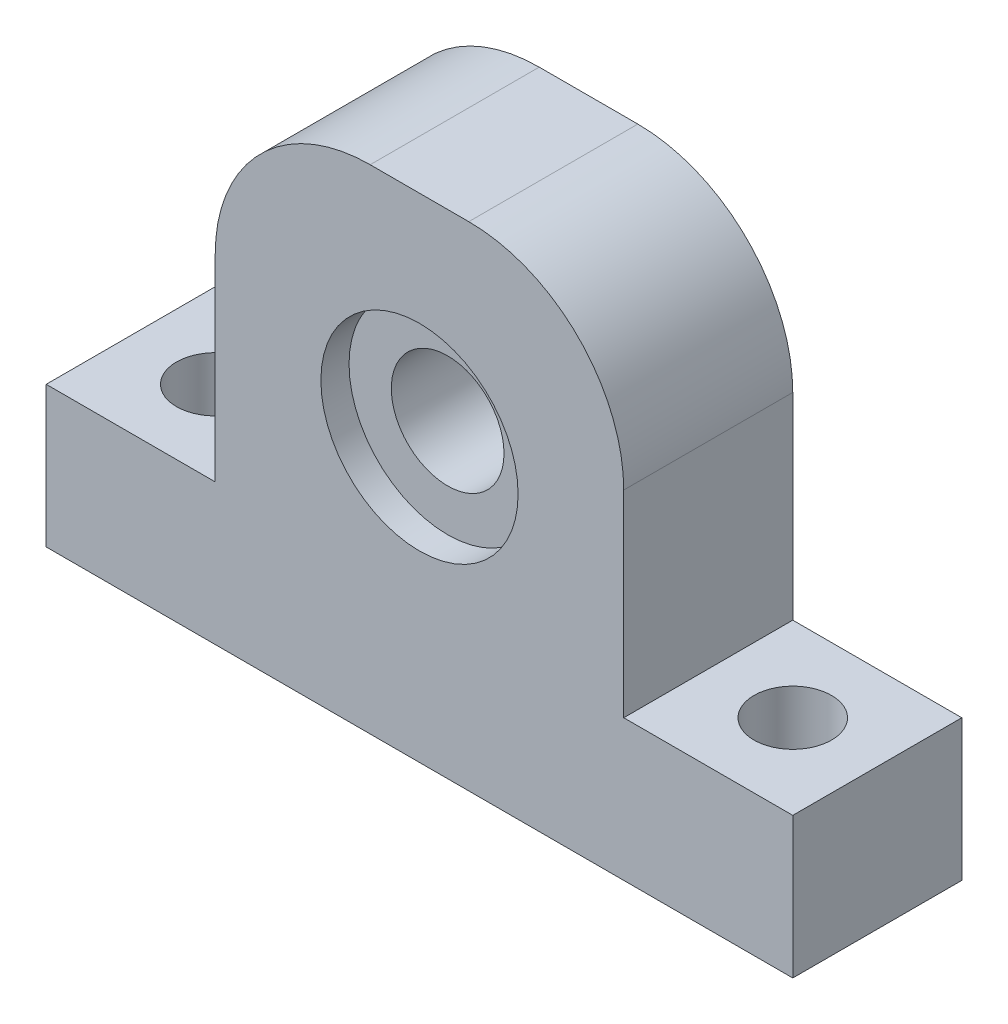
ISO-10303-21;
HEADER;
FILE_DESCRIPTION(('STEP AP214'),'2;1');
FILE_NAME('part.step','',(''),(''),'','','');
FILE_SCHEMA(('AUTOMOTIVE_DESIGN { 1 0 10303 214 1 1 1 1 }'));
ENDSEC;
DATA;
#1=APPLICATION_CONTEXT('core data for automotive mechanical design processes');
#2=APPLICATION_PROTOCOL_DEFINITION('international standard','automotive_design',2000,#1);
#3=PRODUCT_CONTEXT('',#1,'mechanical');
#4=PRODUCT('Part','Part','',(#3));
#5=PRODUCT_RELATED_PRODUCT_CATEGORY('part','',(#4));
#6=PRODUCT_DEFINITION_FORMATION('','',#4);
#7=PRODUCT_DEFINITION_CONTEXT('part definition',#1,'design');
#8=PRODUCT_DEFINITION('design','',#6,#7);
#9=PRODUCT_DEFINITION_SHAPE('','',#8);
#10=(LENGTH_UNIT() NAMED_UNIT(*) SI_UNIT(.MILLI.,.METRE.));
#11=(NAMED_UNIT(*) PLANE_ANGLE_UNIT() SI_UNIT($,.RADIAN.));
#12=(NAMED_UNIT(*) SI_UNIT($,.STERADIAN.) SOLID_ANGLE_UNIT());
#13=UNCERTAINTY_MEASURE_WITH_UNIT(LENGTH_MEASURE(1.E-05),#10,'distance_accuracy_value','');
#14=(GEOMETRIC_REPRESENTATION_CONTEXT(3) GLOBAL_UNCERTAINTY_ASSIGNED_CONTEXT((#13)) GLOBAL_UNIT_ASSIGNED_CONTEXT((#10,
#11,#12)) REPRESENTATION_CONTEXT('',''));
#15=CARTESIAN_POINT('',(0.,0.,0.));
#16=DIRECTION('',(0.,0.,1.));
#17=DIRECTION('',(1.,0.,0.));
#18=AXIS2_PLACEMENT_3D('',#15,#16,#17);
#19=CARTESIAN_POINT('',(0.,0.,-6.));
#20=DIRECTION('',(0.,0.,1.));
#21=DIRECTION('',(1.,0.,0.));
#22=AXIS2_PLACEMENT_3D('',#19,#20,#21);
#23=CYLINDRICAL_SURFACE('',#22,4.);
#24=CARTESIAN_POINT('',(0.,0.,4.));
#25=DIRECTION('',(0.,0.,1.));
#26=DIRECTION('',(1.,0.,0.));
#27=AXIS2_PLACEMENT_3D('',#24,#25,#26);
#28=CIRCLE('',#27,4.);
#29=CARTESIAN_POINT('',(4.,0.,4.));
#30=VERTEX_POINT('',#29);
#31=EDGE_CURVE('E130',#30,#30,#28,.F.);
#32=ORIENTED_EDGE('',*,*,#31,.F.);
#33=EDGE_LOOP('',(#32));
#34=FACE_BOUND('',#33,.T.);
#35=CARTESIAN_POINT('',(0.,0.,-4.));
#36=DIRECTION('',(0.,0.,-1.));
#37=DIRECTION('',(-1.,0.,0.));
#38=AXIS2_PLACEMENT_3D('',#35,#36,#37);
#39=CIRCLE('',#38,4.);
#40=CARTESIAN_POINT('',(-4.,0.,-4.));
#41=VERTEX_POINT('',#40);
#42=EDGE_CURVE('E195',#41,#41,#39,.F.);
#43=ORIENTED_EDGE('',*,*,#42,.F.);
#44=EDGE_LOOP('',(#43));
#45=FACE_BOUND('',#44,.T.);
#46=ADVANCED_FACE('F32',(#34,#45),#23,.F.);
#47=CARTESIAN_POINT('',(-3.5,4.,-6.));
#48=DIRECTION('',(0.,0.,1.));
#49=DIRECTION('',(1.,0.,0.));
#50=AXIS2_PLACEMENT_3D('',#47,#48,#49);
#51=CYLINDRICAL_SURFACE('',#50,11.);
#52=DIRECTION('',(0.,0.,1.));
#53=VECTOR('',#52,1.);
#54=CARTESIAN_POINT('',(-14.5,4.,-6.));
#55=LINE('',#54,#53);
#56=CARTESIAN_POINT('',(-14.5,4.,-6.));
#57=VERTEX_POINT('',#56);
#58=CARTESIAN_POINT('',(-14.5,4.,6.));
#59=VERTEX_POINT('',#58);
#60=EDGE_CURVE('E107',#57,#59,#55,.T.);
#61=ORIENTED_EDGE('',*,*,#60,.T.);
#62=CARTESIAN_POINT('',(-3.5,4.,6.));
#63=DIRECTION('',(0.,0.,1.));
#64=DIRECTION('',(1.,0.,0.));
#65=AXIS2_PLACEMENT_3D('',#62,#63,#64);
#66=CIRCLE('',#65,11.);
#67=CARTESIAN_POINT('',(-3.5,15.,6.));
#68=VERTEX_POINT('',#67);
#69=EDGE_CURVE('E110',#68,#59,#66,.T.);
#70=ORIENTED_EDGE('',*,*,#69,.F.);
#71=DIRECTION('',(0.,0.,1.));
#72=VECTOR('',#71,1.);
#73=CARTESIAN_POINT('',(-3.5,15.,-6.));
#74=LINE('',#73,#72);
#75=CARTESIAN_POINT('',(-3.5,15.,-6.));
#76=VERTEX_POINT('',#75);
#77=EDGE_CURVE('E11',#76,#68,#74,.T.);
#78=ORIENTED_EDGE('',*,*,#77,.F.);
#79=CARTESIAN_POINT('',(-3.5,4.,-6.));
#80=DIRECTION('',(0.,0.,1.));
#81=DIRECTION('',(1.,0.,0.));
#82=AXIS2_PLACEMENT_3D('',#79,#80,#81);
#83=CIRCLE('',#82,11.);
#84=EDGE_CURVE('E111',#76,#57,#83,.T.);
#85=ORIENTED_EDGE('',*,*,#84,.T.);
#86=EDGE_LOOP('',(#61,#70,#78,#85));
#87=FACE_BOUND('',#86,.T.);
#88=ADVANCED_FACE('F34',(#87),#51,.T.);
#89=CARTESIAN_POINT('',(3.5,15.,-6.));
#90=DIRECTION('',(0.,1.,0.));
#91=DIRECTION('',(0.,0.,1.));
#92=AXIS2_PLACEMENT_3D('',#89,#90,#91);
#93=PLANE('',#92);
#94=ORIENTED_EDGE('',*,*,#77,.T.);
#95=DIRECTION('',(-1.,0.,0.));
#96=VECTOR('',#95,1.);
#97=CARTESIAN_POINT('',(3.5,15.,6.));
#98=LINE('',#97,#96);
#99=CARTESIAN_POINT('',(3.5,15.,6.));
#100=VERTEX_POINT('',#99);
#101=EDGE_CURVE('E129',#100,#68,#98,.T.);
#102=ORIENTED_EDGE('',*,*,#101,.F.);
#103=DIRECTION('',(0.,0.,1.));
#104=VECTOR('',#103,1.);
#105=CARTESIAN_POINT('',(3.5,15.,-6.));
#106=LINE('',#105,#104);
#107=CARTESIAN_POINT('',(3.5,15.,-6.));
#108=VERTEX_POINT('',#107);
#109=EDGE_CURVE('E41',#108,#100,#106,.T.);
#110=ORIENTED_EDGE('',*,*,#109,.F.);
#111=DIRECTION('',(-1.,0.,0.));
#112=VECTOR('',#111,1.);
#113=CARTESIAN_POINT('',(3.5,15.,-6.));
#114=LINE('',#113,#112);
#115=EDGE_CURVE('E116',#108,#76,#114,.T.);
#116=ORIENTED_EDGE('',*,*,#115,.T.);
#117=EDGE_LOOP('',(#94,#102,#110,#116));
#118=FACE_BOUND('',#117,.T.);
#119=ADVANCED_FACE('F240',(#118),#93,.T.);
#120=CARTESIAN_POINT('',(3.5,4.,-6.));
#121=DIRECTION('',(0.,0.,1.));
#122=DIRECTION('',(1.,0.,0.));
#123=AXIS2_PLACEMENT_3D('',#120,#121,#122);
#124=CYLINDRICAL_SURFACE('',#123,11.);
#125=ORIENTED_EDGE('',*,*,#109,.T.);
#126=CARTESIAN_POINT('',(3.5,4.,6.));
#127=DIRECTION('',(0.,0.,1.));
#128=DIRECTION('',(-1.,0.,0.));
#129=AXIS2_PLACEMENT_3D('',#126,#127,#128);
#130=CIRCLE('',#129,11.);
#131=CARTESIAN_POINT('',(14.5,4.00000000000001,6.));
#132=VERTEX_POINT('',#131);
#133=EDGE_CURVE('E155',#132,#100,#130,.T.);
#134=ORIENTED_EDGE('',*,*,#133,.F.);
#135=DIRECTION('',(0.,0.,1.));
#136=VECTOR('',#135,1.);
#137=CARTESIAN_POINT('',(14.5,4.00000000000001,-6.));
#138=LINE('',#137,#136);
#139=CARTESIAN_POINT('',(14.5,4.00000000000001,-6.));
#140=VERTEX_POINT('',#139);
#141=EDGE_CURVE('E183',#140,#132,#138,.T.);
#142=ORIENTED_EDGE('',*,*,#141,.F.);
#143=CARTESIAN_POINT('',(3.5,4.,-6.));
#144=DIRECTION('',(0.,0.,1.));
#145=DIRECTION('',(-1.,0.,0.));
#146=AXIS2_PLACEMENT_3D('',#143,#144,#145);
#147=CIRCLE('',#146,11.);
#148=EDGE_CURVE('E179',#140,#108,#147,.T.);
#149=ORIENTED_EDGE('',*,*,#148,.T.);
#150=EDGE_LOOP('',(#125,#134,#142,#149));
#151=FACE_BOUND('',#150,.T.);
#152=ADVANCED_FACE('F246',(#151),#124,.T.);
#153=CARTESIAN_POINT('',(14.5,4.00000000000001,-6.));
#154=DIRECTION('',(1.,0.,0.));
#155=DIRECTION('',(0.,0.,-1.));
#156=AXIS2_PLACEMENT_3D('',#153,#154,#155);
#157=PLANE('',#156);
#158=ORIENTED_EDGE('',*,*,#141,.T.);
#159=DIRECTION('',(0.,1.,0.));
#160=VECTOR('',#159,1.);
#161=CARTESIAN_POINT('',(14.5,4.00000000000001,6.));
#162=LINE('',#161,#160);
#163=CARTESIAN_POINT('',(14.5,-10.,6.));
#164=VERTEX_POINT('',#163);
#165=EDGE_CURVE('E152',#164,#132,#162,.T.);
#166=ORIENTED_EDGE('',*,*,#165,.F.);
#167=DIRECTION('',(0.,0.,1.));
#168=VECTOR('',#167,1.);
#169=CARTESIAN_POINT('',(14.5,-10.,-6.));
#170=LINE('',#169,#168);
#171=CARTESIAN_POINT('',(14.5,-10.,-6.));
#172=VERTEX_POINT('',#171);
#173=EDGE_CURVE('E185',#172,#164,#170,.T.);
#174=ORIENTED_EDGE('',*,*,#173,.F.);
#175=DIRECTION('',(0.,1.,0.));
#176=VECTOR('',#175,1.);
#177=CARTESIAN_POINT('',(14.5,4.00000000000001,-6.));
#178=LINE('',#177,#176);
#179=EDGE_CURVE('E176',#172,#140,#178,.T.);
#180=ORIENTED_EDGE('',*,*,#179,.T.);
#181=EDGE_LOOP('',(#158,#166,#174,#180));
#182=FACE_BOUND('',#181,.T.);
#183=ADVANCED_FACE('F249',(#182),#157,.T.);
#184=CARTESIAN_POINT('',(14.5,-10.,-6.));
#185=DIRECTION('',(0.,1.,0.));
#186=DIRECTION('',(-1.,0.,0.));
#187=AXIS2_PLACEMENT_3D('',#184,#185,#186);
#188=PLANE('',#187);
#189=CARTESIAN_POINT('',(20.5,-9.99999999999999,0.));
#190=DIRECTION('',(0.,1.,0.));
#191=DIRECTION('',(-1.,0.,0.));
#192=AXIS2_PLACEMENT_3D('',#189,#190,#191);
#193=CIRCLE('',#192,2.75);
#194=CARTESIAN_POINT('',(17.75,-9.99999999999999,0.));
#195=VERTEX_POINT('',#194);
#196=EDGE_CURVE('E351',#195,#195,#193,.T.);
#197=ORIENTED_EDGE('',*,*,#196,.F.);
#198=EDGE_LOOP('',(#197));
#199=FACE_BOUND('',#198,.T.);
#200=ORIENTED_EDGE('',*,*,#173,.T.);
#201=DIRECTION('',(-1.,0.,0.));
#202=VECTOR('',#201,1.);
#203=CARTESIAN_POINT('',(14.5,-10.,6.));
#204=LINE('',#203,#202);
#205=CARTESIAN_POINT('',(26.5,-9.99999999999999,6.));
#206=VERTEX_POINT('',#205);
#207=EDGE_CURVE('E149',#206,#164,#204,.T.);
#208=ORIENTED_EDGE('',*,*,#207,.F.);
#209=DIRECTION('',(0.,0.,1.));
#210=VECTOR('',#209,1.);
#211=CARTESIAN_POINT('',(26.5,-9.99999999999999,-6.));
#212=LINE('',#211,#210);
#213=CARTESIAN_POINT('',(26.5,-9.99999999999999,-6.));
#214=VERTEX_POINT('',#213);
#215=EDGE_CURVE('E187',#214,#206,#212,.T.);
#216=ORIENTED_EDGE('',*,*,#215,.F.);
#217=DIRECTION('',(-1.,0.,0.));
#218=VECTOR('',#217,1.);
#219=CARTESIAN_POINT('',(14.5,-10.,-6.));
#220=LINE('',#219,#218);
#221=EDGE_CURVE('E173',#214,#172,#220,.T.);
#222=ORIENTED_EDGE('',*,*,#221,.T.);
#223=EDGE_LOOP('',(#200,#208,#216,#222));
#224=FACE_BOUND('',#223,.T.);
#225=ADVANCED_FACE('F253',(#199,#224),#188,.T.);
#226=CARTESIAN_POINT('',(26.5,-9.99999999999999,-6.));
#227=DIRECTION('',(1.,0.,0.));
#228=DIRECTION('',(0.,0.,-1.));
#229=AXIS2_PLACEMENT_3D('',#226,#227,#228);
#230=PLANE('',#229);
#231=ORIENTED_EDGE('',*,*,#215,.T.);
#232=DIRECTION('',(0.,1.,0.));
#233=VECTOR('',#232,1.);
#234=CARTESIAN_POINT('',(26.5,-9.99999999999999,6.));
#235=LINE('',#234,#233);
#236=CARTESIAN_POINT('',(26.5,-20.,6.));
#237=VERTEX_POINT('',#236);
#238=EDGE_CURVE('E146',#237,#206,#235,.T.);
#239=ORIENTED_EDGE('',*,*,#238,.F.);
#240=DIRECTION('',(0.,0.,1.));
#241=VECTOR('',#240,1.);
#242=CARTESIAN_POINT('',(26.5,-20.,-6.));
#243=LINE('',#242,#241);
#244=CARTESIAN_POINT('',(26.5,-20.,-6.));
#245=VERTEX_POINT('',#244);
#246=EDGE_CURVE('E189',#245,#237,#243,.T.);
#247=ORIENTED_EDGE('',*,*,#246,.F.);
#248=DIRECTION('',(0.,1.,0.));
#249=VECTOR('',#248,1.);
#250=CARTESIAN_POINT('',(26.5,-9.99999999999999,-6.));
#251=LINE('',#250,#249);
#252=EDGE_CURVE('E170',#245,#214,#251,.T.);
#253=ORIENTED_EDGE('',*,*,#252,.T.);
#254=EDGE_LOOP('',(#231,#239,#247,#253));
#255=FACE_BOUND('',#254,.T.);
#256=ADVANCED_FACE('F257',(#255),#230,.T.);
#257=CARTESIAN_POINT('',(-26.5,-20.,-6.));
#258=DIRECTION('',(0.,-1.,0.));
#259=DIRECTION('',(1.,0.,0.));
#260=AXIS2_PLACEMENT_3D('',#257,#258,#259);
#261=PLANE('',#260);
#262=CARTESIAN_POINT('',(20.5,-20.,0.));
#263=DIRECTION('',(0.,-1.,0.));
#264=DIRECTION('',(0.,0.,1.));
#265=AXIS2_PLACEMENT_3D('',#262,#263,#264);
#266=CIRCLE('',#265,2.75);
#267=CARTESIAN_POINT('',(20.5,-20.,2.75));
#268=VERTEX_POINT('',#267);
#269=EDGE_CURVE('E354',#268,#268,#266,.T.);
#270=ORIENTED_EDGE('',*,*,#269,.F.);
#271=EDGE_LOOP('',(#270));
#272=FACE_BOUND('',#271,.T.);
#273=CARTESIAN_POINT('',(-20.5,-20.,0.));
#274=DIRECTION('',(0.,-1.,0.));
#275=DIRECTION('',(0.,0.,-1.));
#276=AXIS2_PLACEMENT_3D('',#273,#274,#275);
#277=CIRCLE('',#276,2.75);
#278=CARTESIAN_POINT('',(-20.5,-20.,-2.75));
#279=VERTEX_POINT('',#278);
#280=EDGE_CURVE('E209',#279,#279,#277,.T.);
#281=ORIENTED_EDGE('',*,*,#280,.F.);
#282=EDGE_LOOP('',(#281));
#283=FACE_BOUND('',#282,.T.);
#284=ORIENTED_EDGE('',*,*,#246,.T.);
#285=DIRECTION('',(1.,0.,0.));
#286=VECTOR('',#285,1.);
#287=CARTESIAN_POINT('',(-26.5,-20.,6.));
#288=LINE('',#287,#286);
#289=CARTESIAN_POINT('',(-26.5,-20.,6.));
#290=VERTEX_POINT('',#289);
#291=EDGE_CURVE('E143',#290,#237,#288,.T.);
#292=ORIENTED_EDGE('',*,*,#291,.F.);
#293=DIRECTION('',(0.,0.,1.));
#294=VECTOR('',#293,1.);
#295=CARTESIAN_POINT('',(-26.5,-20.,-6.));
#296=LINE('',#295,#294);
#297=CARTESIAN_POINT('',(-26.5,-20.,-6.));
#298=VERTEX_POINT('',#297);
#299=EDGE_CURVE('E191',#298,#290,#296,.T.);
#300=ORIENTED_EDGE('',*,*,#299,.F.);
#301=DIRECTION('',(1.,0.,0.));
#302=VECTOR('',#301,1.);
#303=CARTESIAN_POINT('',(-26.5,-20.,-6.));
#304=LINE('',#303,#302);
#305=EDGE_CURVE('E167',#298,#245,#304,.T.);
#306=ORIENTED_EDGE('',*,*,#305,.T.);
#307=EDGE_LOOP('',(#284,#292,#300,#306));
#308=FACE_BOUND('',#307,.T.);
#309=ADVANCED_FACE('F261',(#272,#283,#308),#261,.T.);
#310=CARTESIAN_POINT('',(-26.5,-10.,-6.));
#311=DIRECTION('',(-1.,0.,0.));
#312=DIRECTION('',(0.,0.,1.));
#313=AXIS2_PLACEMENT_3D('',#310,#311,#312);
#314=PLANE('',#313);
#315=ORIENTED_EDGE('',*,*,#299,.T.);
#316=DIRECTION('',(0.,-1.,0.));
#317=VECTOR('',#316,1.);
#318=CARTESIAN_POINT('',(-26.5,-10.,6.));
#319=LINE('',#318,#317);
#320=CARTESIAN_POINT('',(-26.5,-10.,6.));
#321=VERTEX_POINT('',#320);
#322=EDGE_CURVE('E140',#321,#290,#319,.T.);
#323=ORIENTED_EDGE('',*,*,#322,.F.);
#324=DIRECTION('',(0.,0.,1.));
#325=VECTOR('',#324,1.);
#326=CARTESIAN_POINT('',(-26.5,-10.,-6.));
#327=LINE('',#326,#325);
#328=CARTESIAN_POINT('',(-26.5,-10.,-6.));
#329=VERTEX_POINT('',#328);
#330=EDGE_CURVE('E193',#329,#321,#327,.T.);
#331=ORIENTED_EDGE('',*,*,#330,.F.);
#332=DIRECTION('',(0.,-1.,0.));
#333=VECTOR('',#332,1.);
#334=CARTESIAN_POINT('',(-26.5,-10.,-6.));
#335=LINE('',#334,#333);
#336=EDGE_CURVE('E164',#329,#298,#335,.T.);
#337=ORIENTED_EDGE('',*,*,#336,.T.);
#338=EDGE_LOOP('',(#315,#323,#331,#337));
#339=FACE_BOUND('',#338,.T.);
#340=ADVANCED_FACE('F265',(#339),#314,.T.);
#341=CARTESIAN_POINT('',(-14.5,-10.,-6.));
#342=DIRECTION('',(0.,1.,0.));
#343=DIRECTION('',(0.,0.,1.));
#344=AXIS2_PLACEMENT_3D('',#341,#342,#343);
#345=PLANE('',#344);
#346=CARTESIAN_POINT('',(-20.5,-10.,0.));
#347=DIRECTION('',(0.,1.,0.));
#348=DIRECTION('',(0.,0.,1.));
#349=AXIS2_PLACEMENT_3D('',#346,#347,#348);
#350=CIRCLE('',#349,2.75);
#351=CARTESIAN_POINT('',(-20.5,-10.,2.75));
#352=VERTEX_POINT('',#351);
#353=EDGE_CURVE('E36',#352,#352,#350,.T.);
#354=ORIENTED_EDGE('',*,*,#353,.F.);
#355=EDGE_LOOP('',(#354));
#356=FACE_BOUND('',#355,.T.);
#357=ORIENTED_EDGE('',*,*,#330,.T.);
#358=DIRECTION('',(-1.,0.,0.));
#359=VECTOR('',#358,1.);
#360=CARTESIAN_POINT('',(-14.5,-10.,6.));
#361=LINE('',#360,#359);
#362=CARTESIAN_POINT('',(-14.5,-10.,6.));
#363=VERTEX_POINT('',#362);
#364=EDGE_CURVE('E124',#363,#321,#361,.T.);
#365=ORIENTED_EDGE('',*,*,#364,.F.);
#366=DIRECTION('',(0.,0.,1.));
#367=VECTOR('',#366,1.);
#368=CARTESIAN_POINT('',(-14.5,-10.,-6.));
#369=LINE('',#368,#367);
#370=CARTESIAN_POINT('',(-14.5,-10.,-6.));
#371=VERTEX_POINT('',#370);
#372=EDGE_CURVE('E115',#371,#363,#369,.T.);
#373=ORIENTED_EDGE('',*,*,#372,.F.);
#374=DIRECTION('',(-1.,0.,0.));
#375=VECTOR('',#374,1.);
#376=CARTESIAN_POINT('',(-14.5,-10.,-6.));
#377=LINE('',#376,#375);
#378=EDGE_CURVE('E161',#371,#329,#377,.T.);
#379=ORIENTED_EDGE('',*,*,#378,.T.);
#380=EDGE_LOOP('',(#357,#365,#373,#379));
#381=FACE_BOUND('',#380,.T.);
#382=ADVANCED_FACE('F269',(#356,#381),#345,.T.);
#383=CARTESIAN_POINT('',(-14.5,4.,-6.));
#384=DIRECTION('',(-1.,0.,0.));
#385=DIRECTION('',(0.,-1.,0.));
#386=AXIS2_PLACEMENT_3D('',#383,#384,#385);
#387=PLANE('',#386);
#388=ORIENTED_EDGE('',*,*,#372,.T.);
#389=DIRECTION('',(0.,-1.,0.));
#390=VECTOR('',#389,1.);
#391=CARTESIAN_POINT('',(-14.5,4.,6.));
#392=LINE('',#391,#390);
#393=EDGE_CURVE('E119',#59,#363,#392,.T.);
#394=ORIENTED_EDGE('',*,*,#393,.F.);
#395=ORIENTED_EDGE('',*,*,#60,.F.);
#396=DIRECTION('',(0.,-1.,0.));
#397=VECTOR('',#396,1.);
#398=CARTESIAN_POINT('',(-14.5,4.,-6.));
#399=LINE('',#398,#397);
#400=EDGE_CURVE('E159',#57,#371,#399,.T.);
#401=ORIENTED_EDGE('',*,*,#400,.T.);
#402=EDGE_LOOP('',(#388,#394,#395,#401));
#403=FACE_BOUND('',#402,.T.);
#404=ADVANCED_FACE('F120',(#403),#387,.T.);
#405=CARTESIAN_POINT('',(-3.5,4.,-6.));
#406=DIRECTION('',(0.,0.,1.));
#407=DIRECTION('',(1.,0.,0.));
#408=AXIS2_PLACEMENT_3D('',#405,#406,#407);
#409=PLANE('',#408);
#410=CARTESIAN_POINT('',(0.,0.,-6.));
#411=DIRECTION('',(0.,0.,-1.));
#412=DIRECTION('',(-1.,0.,0.));
#413=AXIS2_PLACEMENT_3D('',#410,#411,#412);
#414=CIRCLE('',#413,7.);
#415=CARTESIAN_POINT('',(-7.,0.,-6.));
#416=VERTEX_POINT('',#415);
#417=EDGE_CURVE('E202',#416,#416,#414,.T.);
#418=ORIENTED_EDGE('',*,*,#417,.F.);
#419=EDGE_LOOP('',(#418));
#420=FACE_BOUND('',#419,.T.);
#421=ORIENTED_EDGE('',*,*,#84,.F.);
#422=ORIENTED_EDGE('',*,*,#115,.F.);
#423=ORIENTED_EDGE('',*,*,#148,.F.);
#424=ORIENTED_EDGE('',*,*,#179,.F.);
#425=ORIENTED_EDGE('',*,*,#221,.F.);
#426=ORIENTED_EDGE('',*,*,#252,.F.);
#427=ORIENTED_EDGE('',*,*,#305,.F.);
#428=ORIENTED_EDGE('',*,*,#336,.F.);
#429=ORIENTED_EDGE('',*,*,#378,.F.);
#430=ORIENTED_EDGE('',*,*,#400,.F.);
#431=EDGE_LOOP('',(#421,#422,#423,#424,#425,#426,#427,#428,#429,#430));
#432=FACE_BOUND('',#431,.T.);
#433=ADVANCED_FACE('F225',(#420,#432),#409,.F.);
#434=CARTESIAN_POINT('',(-3.5,4.,6.));
#435=DIRECTION('',(0.,0.,1.));
#436=DIRECTION('',(1.,0.,0.));
#437=AXIS2_PLACEMENT_3D('',#434,#435,#436);
#438=PLANE('',#437);
#439=CARTESIAN_POINT('',(0.,0.,6.));
#440=DIRECTION('',(0.,0.,1.));
#441=DIRECTION('',(1.,0.,0.));
#442=AXIS2_PLACEMENT_3D('',#439,#440,#441);
#443=CIRCLE('',#442,7.);
#444=CARTESIAN_POINT('',(7.,0.,6.));
#445=VERTEX_POINT('',#444);
#446=EDGE_CURVE('E136',#445,#445,#443,.T.);
#447=ORIENTED_EDGE('',*,*,#446,.F.);
#448=EDGE_LOOP('',(#447));
#449=FACE_BOUND('',#448,.T.);
#450=ORIENTED_EDGE('',*,*,#69,.T.);
#451=ORIENTED_EDGE('',*,*,#393,.T.);
#452=ORIENTED_EDGE('',*,*,#364,.T.);
#453=ORIENTED_EDGE('',*,*,#322,.T.);
#454=ORIENTED_EDGE('',*,*,#291,.T.);
#455=ORIENTED_EDGE('',*,*,#238,.T.);
#456=ORIENTED_EDGE('',*,*,#207,.T.);
#457=ORIENTED_EDGE('',*,*,#165,.T.);
#458=ORIENTED_EDGE('',*,*,#133,.T.);
#459=ORIENTED_EDGE('',*,*,#101,.T.);
#460=EDGE_LOOP('',(#450,#451,#452,#453,#454,#455,#456,#457,#458,#459));
#461=FACE_BOUND('',#460,.T.);
#462=ADVANCED_FACE('F127',(#449,#461),#438,.T.);
#463=CARTESIAN_POINT('',(0.,0.,4.));
#464=DIRECTION('',(0.,0.,1.));
#465=DIRECTION('',(1.,0.,0.));
#466=AXIS2_PLACEMENT_3D('',#463,#464,#465);
#467=PLANE('',#466);
#468=CARTESIAN_POINT('',(0.,0.,4.));
#469=DIRECTION('',(0.,0.,1.));
#470=DIRECTION('',(1.,0.,0.));
#471=AXIS2_PLACEMENT_3D('',#468,#469,#470);
#472=CIRCLE('',#471,7.);
#473=CARTESIAN_POINT('',(7.,0.,4.));
#474=VERTEX_POINT('',#473);
#475=EDGE_CURVE('E133',#474,#474,#472,.T.);
#476=ORIENTED_EDGE('',*,*,#475,.T.);
#477=EDGE_LOOP('',(#476));
#478=FACE_BOUND('',#477,.T.);
#479=ORIENTED_EDGE('',*,*,#31,.T.);
#480=EDGE_LOOP('',(#479));
#481=FACE_BOUND('',#480,.T.);
#482=ADVANCED_FACE('F214',(#478,#481),#467,.T.);
#483=CARTESIAN_POINT('',(0.,0.,4.));
#484=DIRECTION('',(0.,0.,1.));
#485=DIRECTION('',(1.,0.,0.));
#486=AXIS2_PLACEMENT_3D('',#483,#484,#485);
#487=CYLINDRICAL_SURFACE('',#486,7.);
#488=ORIENTED_EDGE('',*,*,#475,.F.);
#489=EDGE_LOOP('',(#488));
#490=FACE_BOUND('',#489,.T.);
#491=ORIENTED_EDGE('',*,*,#446,.T.);
#492=EDGE_LOOP('',(#491));
#493=FACE_BOUND('',#492,.T.);
#494=ADVANCED_FACE('F217',(#490,#493),#487,.F.);
#495=CARTESIAN_POINT('',(0.,0.,-4.));
#496=DIRECTION('',(0.,0.,-1.));
#497=DIRECTION('',(-1.,0.,0.));
#498=AXIS2_PLACEMENT_3D('',#495,#496,#497);
#499=PLANE('',#498);
#500=CARTESIAN_POINT('',(0.,0.,-4.));
#501=DIRECTION('',(0.,0.,-1.));
#502=DIRECTION('',(-1.,0.,0.));
#503=AXIS2_PLACEMENT_3D('',#500,#501,#502);
#504=CIRCLE('',#503,7.);
#505=CARTESIAN_POINT('',(-7.,0.,-4.));
#506=VERTEX_POINT('',#505);
#507=EDGE_CURVE('E197',#506,#506,#504,.T.);
#508=ORIENTED_EDGE('',*,*,#507,.T.);
#509=EDGE_LOOP('',(#508));
#510=FACE_BOUND('',#509,.T.);
#511=ORIENTED_EDGE('',*,*,#42,.T.);
#512=EDGE_LOOP('',(#511));
#513=FACE_BOUND('',#512,.T.);
#514=ADVANCED_FACE('F220',(#510,#513),#499,.T.);
#515=CARTESIAN_POINT('',(0.,0.,-4.));
#516=DIRECTION('',(0.,0.,-1.));
#517=DIRECTION('',(-1.,0.,0.));
#518=AXIS2_PLACEMENT_3D('',#515,#516,#517);
#519=CYLINDRICAL_SURFACE('',#518,7.);
#520=ORIENTED_EDGE('',*,*,#507,.F.);
#521=EDGE_LOOP('',(#520));
#522=FACE_BOUND('',#521,.T.);
#523=ORIENTED_EDGE('',*,*,#417,.T.);
#524=EDGE_LOOP('',(#523));
#525=FACE_BOUND('',#524,.T.);
#526=ADVANCED_FACE('F296',(#522,#525),#519,.F.);
#527=CARTESIAN_POINT('',(-20.5,-2.99999999999999,0.));
#528=DIRECTION('',(0.,-1.,0.));
#529=DIRECTION('',(0.,0.,-1.));
#530=AXIS2_PLACEMENT_3D('',#527,#528,#529);
#531=CYLINDRICAL_SURFACE('',#530,2.75);
#532=ORIENTED_EDGE('',*,*,#353,.T.);
#533=EDGE_LOOP('',(#532));
#534=FACE_BOUND('',#533,.T.);
#535=ORIENTED_EDGE('',*,*,#280,.T.);
#536=EDGE_LOOP('',(#535));
#537=FACE_BOUND('',#536,.T.);
#538=ADVANCED_FACE('F305',(#534,#537),#531,.F.);
#539=CARTESIAN_POINT('',(20.5,-2.99999999999999,0.));
#540=DIRECTION('',(0.,-1.,0.));
#541=DIRECTION('',(0.,0.,-1.));
#542=AXIS2_PLACEMENT_3D('',#539,#540,#541);
#543=CYLINDRICAL_SURFACE('',#542,2.75);
#544=ORIENTED_EDGE('',*,*,#196,.T.);
#545=EDGE_LOOP('',(#544));
#546=FACE_BOUND('',#545,.T.);
#547=ORIENTED_EDGE('',*,*,#269,.T.);
#548=EDGE_LOOP('',(#547));
#549=FACE_BOUND('',#548,.T.);
#550=ADVANCED_FACE('F334',(#546,#549),#543,.F.);
#551=CLOSED_SHELL('',(#46,#88,#119,#152,#183,#225,#256,#309,#340,#382,#404,#433,#462,#482,#494,
#514,#526,#538,#550));
#552=MANIFOLD_SOLID_BREP('B2',#551);
#553=ADVANCED_BREP_SHAPE_REPRESENTATION('',(#18,#552),#14);
#554=SHAPE_DEFINITION_REPRESENTATION(#9,#553);
ENDSEC;
END-ISO-10303-21;
